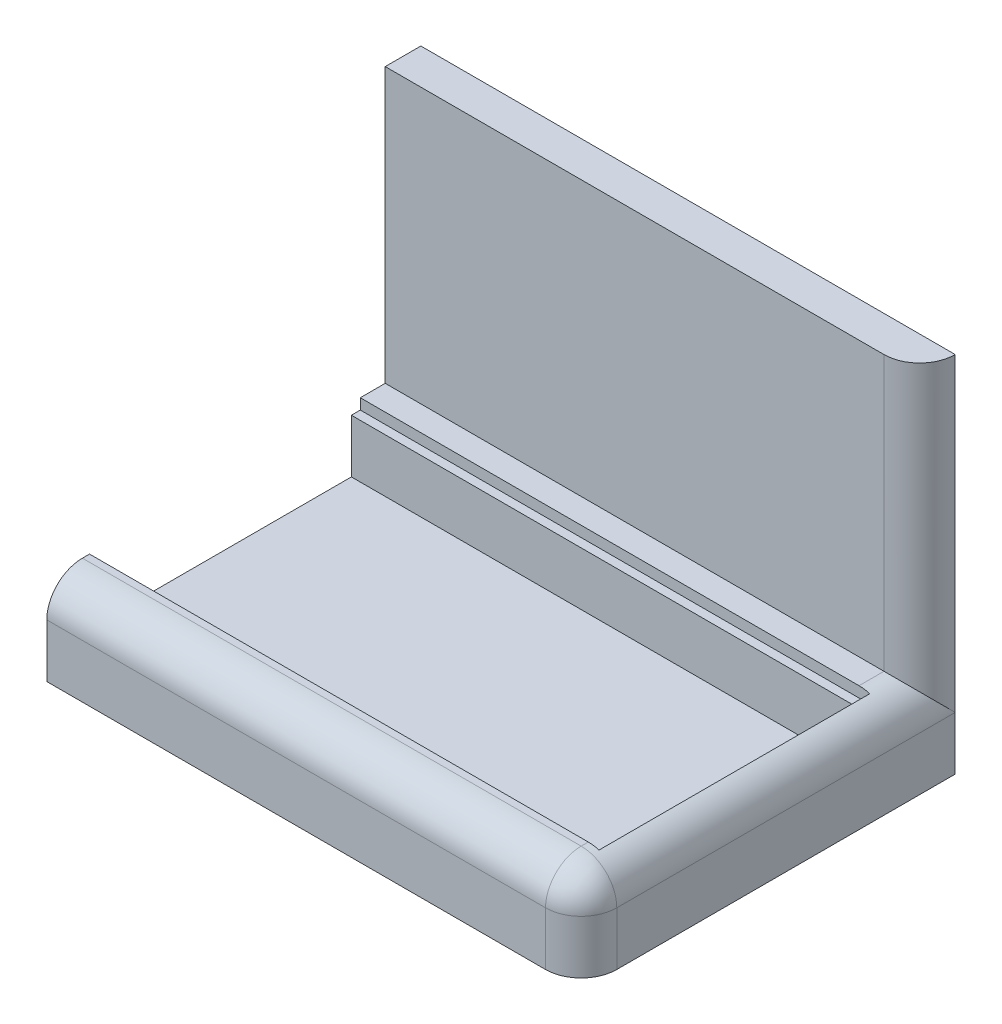
ISO-10303-21;
HEADER;
FILE_DESCRIPTION(('STEP AP214'),'2;1');
FILE_NAME('part.step','',(''),(''),'','','');
FILE_SCHEMA(('AUTOMOTIVE_DESIGN { 1 0 10303 214 1 1 1 1 }'));
ENDSEC;
DATA;
#1=APPLICATION_CONTEXT('core data for automotive mechanical design processes');
#2=APPLICATION_PROTOCOL_DEFINITION('international standard','automotive_design',2000,#1);
#3=PRODUCT_CONTEXT('',#1,'mechanical');
#4=PRODUCT('Part','Part','',(#3));
#5=PRODUCT_RELATED_PRODUCT_CATEGORY('part','',(#4));
#6=PRODUCT_DEFINITION_FORMATION('','',#4);
#7=PRODUCT_DEFINITION_CONTEXT('part definition',#1,'design');
#8=PRODUCT_DEFINITION('design','',#6,#7);
#9=PRODUCT_DEFINITION_SHAPE('','',#8);
#10=(LENGTH_UNIT() NAMED_UNIT(*) SI_UNIT(.MILLI.,.METRE.));
#11=(NAMED_UNIT(*) PLANE_ANGLE_UNIT() SI_UNIT($,.RADIAN.));
#12=(NAMED_UNIT(*) SI_UNIT($,.STERADIAN.) SOLID_ANGLE_UNIT());
#13=UNCERTAINTY_MEASURE_WITH_UNIT(LENGTH_MEASURE(1.E-05),#10,'distance_accuracy_value','');
#14=(GEOMETRIC_REPRESENTATION_CONTEXT(3) GLOBAL_UNCERTAINTY_ASSIGNED_CONTEXT((#13)) GLOBAL_UNIT_ASSIGNED_CONTEXT((#10,
#11,#12)) REPRESENTATION_CONTEXT('',''));
#15=CARTESIAN_POINT('',(0.,0.,0.));
#16=DIRECTION('',(0.,0.,1.));
#17=DIRECTION('',(1.,0.,0.));
#18=AXIS2_PLACEMENT_3D('',#15,#16,#17);
#19=CARTESIAN_POINT('',(0.,0.,-37.2835672247753));
#20=DIRECTION('',(0.,0.,1.));
#21=DIRECTION('',(1.,0.,0.));
#22=AXIS2_PLACEMENT_3D('',#19,#20,#21);
#23=PLANE('',#22);
#24=DIRECTION('',(0.,-1.,0.));
#25=VECTOR('',#24,1.);
#26=CARTESIAN_POINT('',(103.375697670527,0.,-37.2835672247753));
#27=LINE('',#26,#25);
#28=CARTESIAN_POINT('',(103.375697670527,102.,-37.2835672247753));
#29=VERTEX_POINT('',#28);
#30=CARTESIAN_POINT('',(103.375697670527,0.,-37.2835672247753));
#31=VERTEX_POINT('',#30);
#32=EDGE_CURVE('E179',#29,#31,#27,.T.);
#33=ORIENTED_EDGE('',*,*,#32,.F.);
#34=DIRECTION('',(-1.,0.,0.));
#35=VECTOR('',#34,1.);
#36=CARTESIAN_POINT('',(0.,102.,-37.2835672247753));
#37=LINE('',#36,#35);
#38=CARTESIAN_POINT('',(253.375697670527,102.,-37.2835672247753));
#39=VERTEX_POINT('',#38);
#40=EDGE_CURVE('E185',#39,#29,#37,.T.);
#41=ORIENTED_EDGE('',*,*,#40,.F.);
#42=DIRECTION('',(0.,-1.,0.));
#43=VECTOR('',#42,1.);
#44=CARTESIAN_POINT('',(253.375697670527,0.,-37.2835672247753));
#45=LINE('',#44,#43);
#46=CARTESIAN_POINT('',(253.375697670527,15.,-37.2835672247753));
#47=VERTEX_POINT('',#46);
#48=EDGE_CURVE('E80',#39,#47,#45,.T.);
#49=ORIENTED_EDGE('',*,*,#48,.T.);
#50=CARTESIAN_POINT('',(253.375697670527,0.,-37.2835672247753));
#51=VERTEX_POINT('',#50);
#52=EDGE_CURVE('E204',#47,#51,#45,.T.);
#53=ORIENTED_EDGE('',*,*,#52,.T.);
#54=DIRECTION('',(-1.,0.,0.));
#55=VECTOR('',#54,1.);
#56=CARTESIAN_POINT('',(253.375697670527,0.,-37.2835672247753));
#57=LINE('',#56,#55);
#58=EDGE_CURVE('E187',#51,#31,#57,.T.);
#59=ORIENTED_EDGE('',*,*,#58,.T.);
#60=EDGE_LOOP('',(#33,#41,#49,#53,#59));
#61=FACE_BOUND('',#60,.T.);
#62=ADVANCED_FACE('F56',(#61),#23,.F.);
#63=CARTESIAN_POINT('',(0.,25.,0.));
#64=DIRECTION('',(0.,1.,0.));
#65=DIRECTION('',(0.,0.,1.));
#66=AXIS2_PLACEMENT_3D('',#63,#64,#65);
#67=PLANE('',#66);
#68=DIRECTION('',(-1.,0.,0.));
#69=VECTOR('',#68,1.);
#70=CARTESIAN_POINT('',(-46.6243023294728,25.,-27.2835672247753));
#71=LINE('',#70,#69);
#72=CARTESIAN_POINT('',(243.375697670527,25.,-27.2835672247753));
#73=VERTEX_POINT('',#72);
#74=CARTESIAN_POINT('',(103.375697670527,25.,-27.2835672247753));
#75=VERTEX_POINT('',#74);
#76=EDGE_CURVE('E246',#73,#75,#71,.T.);
#77=ORIENTED_EDGE('',*,*,#76,.T.);
#78=DIRECTION('',(0.,0.,1.));
#79=VECTOR('',#78,1.);
#80=CARTESIAN_POINT('',(103.375697670527,25.,0.));
#81=LINE('',#80,#79);
#82=CARTESIAN_POINT('',(103.375697670527,25.,-20.2835672247753));
#83=VERTEX_POINT('',#82);
#84=EDGE_CURVE('E189',#75,#83,#81,.T.);
#85=ORIENTED_EDGE('',*,*,#84,.T.);
#86=DIRECTION('',(-1.,0.,0.));
#87=VECTOR('',#86,1.);
#88=CARTESIAN_POINT('',(79.630106090259,25.,-20.2835672247753));
#89=LINE('',#88,#87);
#90=CARTESIAN_POINT('',(243.375697670527,25.,-20.2835672247753));
#91=VERTEX_POINT('',#90);
#92=EDGE_CURVE('E230',#91,#83,#89,.T.);
#93=ORIENTED_EDGE('',*,*,#92,.F.);
#94=DIRECTION('',(0.,0.,-1.));
#95=VECTOR('',#94,1.);
#96=CARTESIAN_POINT('',(243.375697670527,25.,-27.2835672247753));
#97=LINE('',#96,#95);
#98=EDGE_CURVE('E270',#91,#73,#97,.T.);
#99=ORIENTED_EDGE('',*,*,#98,.T.);
#100=EDGE_LOOP('',(#77,#85,#93,#99));
#101=FACE_BOUND('',#100,.T.);
#102=ADVANCED_FACE('F352',(#101),#67,.T.);
#103=DIRECTION('',(1.,0.,0.));
#104=VECTOR('',#103,1.);
#105=CARTESIAN_POINT('',(79.630106090259,25.,55.7164327752247));
#106=LINE('',#105,#104);
#107=CARTESIAN_POINT('',(103.375697670527,25.,55.7164327752247));
#108=VERTEX_POINT('',#107);
#109=CARTESIAN_POINT('',(243.375697670527,25.,55.7164327752247));
#110=VERTEX_POINT('',#109);
#111=EDGE_CURVE('E224',#108,#110,#106,.T.);
#112=ORIENTED_EDGE('',*,*,#111,.F.);
#113=CARTESIAN_POINT('',(103.375697670527,25.,57.7164327752247));
#114=VERTEX_POINT('',#113);
#115=EDGE_CURVE('E319',#108,#114,#81,.T.);
#116=ORIENTED_EDGE('',*,*,#115,.T.);
#117=DIRECTION('',(1.,0.,0.));
#118=VECTOR('',#117,1.);
#119=CARTESIAN_POINT('',(253.375697670527,25.,57.7164327752247));
#120=LINE('',#119,#118);
#121=CARTESIAN_POINT('',(243.375697670527,25.,57.7164327752247));
#122=VERTEX_POINT('',#121);
#123=EDGE_CURVE('E60',#114,#122,#120,.T.);
#124=ORIENTED_EDGE('',*,*,#123,.T.);
#125=DIRECTION('',(0.,0.,-1.));
#126=VECTOR('',#125,1.);
#127=CARTESIAN_POINT('',(243.375697670527,25.,-27.2835672247753));
#128=LINE('',#127,#126);
#129=EDGE_CURVE('E273',#122,#110,#128,.T.);
#130=ORIENTED_EDGE('',*,*,#129,.T.);
#131=EDGE_LOOP('',(#112,#116,#124,#130));
#132=FACE_BOUND('',#131,.T.);
#133=ADVANCED_FACE('F358',(#132),#67,.T.);
#134=CARTESIAN_POINT('',(0.,0.,-27.2835672247753));
#135=DIRECTION('',(0.,0.,1.));
#136=DIRECTION('',(1.,0.,0.));
#137=AXIS2_PLACEMENT_3D('',#134,#135,#136);
#138=PLANE('',#137);
#139=DIRECTION('',(-1.,0.,0.));
#140=VECTOR('',#139,1.);
#141=CARTESIAN_POINT('',(-36.6243023294728,102.,-27.2835672247753));
#142=LINE('',#141,#140);
#143=CARTESIAN_POINT('',(243.375697670527,102.,-27.2835672247753));
#144=VERTEX_POINT('',#143);
#145=CARTESIAN_POINT('',(103.375697670527,102.,-27.2835672247753));
#146=VERTEX_POINT('',#145);
#147=EDGE_CURVE('E66',#144,#146,#142,.T.);
#148=ORIENTED_EDGE('',*,*,#147,.T.);
#149=DIRECTION('',(0.,-1.,0.));
#150=VECTOR('',#149,1.);
#151=CARTESIAN_POINT('',(103.375697670527,0.,-27.2835672247753));
#152=LINE('',#151,#150);
#153=EDGE_CURVE('E73',#146,#75,#152,.T.);
#154=ORIENTED_EDGE('',*,*,#153,.T.);
#155=ORIENTED_EDGE('',*,*,#76,.F.);
#156=DIRECTION('',(0.,-1.,0.));
#157=VECTOR('',#156,1.);
#158=CARTESIAN_POINT('',(243.375697670527,112.,-27.2835672247753));
#159=LINE('',#158,#157);
#160=EDGE_CURVE('E281',#73,#144,#159,.F.);
#161=ORIENTED_EDGE('',*,*,#160,.T.);
#162=EDGE_LOOP('',(#148,#154,#155,#161));
#163=FACE_BOUND('',#162,.T.);
#164=ADVANCED_FACE('F290',(#163),#138,.T.);
#165=CARTESIAN_POINT('',(-46.6243023294728,25.,67.7164327752247));
#166=DIRECTION('',(0.,0.,-1.));
#167=DIRECTION('',(-1.,0.,0.));
#168=AXIS2_PLACEMENT_3D('',#165,#166,#167);
#169=PLANE('',#168);
#170=DIRECTION('',(0.,1.,0.));
#171=VECTOR('',#170,1.);
#172=CARTESIAN_POINT('',(103.375697670527,25.,67.7164327752247));
#173=LINE('',#172,#171);
#174=CARTESIAN_POINT('',(103.375697670527,0.,67.7164327752247));
#175=VERTEX_POINT('',#174);
#176=CARTESIAN_POINT('',(103.375697670527,15.,67.7164327752247));
#177=VERTEX_POINT('',#176);
#178=EDGE_CURVE('E308',#175,#177,#173,.T.);
#179=ORIENTED_EDGE('',*,*,#178,.F.);
#180=DIRECTION('',(1.,0.,0.));
#181=VECTOR('',#180,1.);
#182=CARTESIAN_POINT('',(-46.6243023294728,0.,67.7164327752247));
#183=LINE('',#182,#181);
#184=CARTESIAN_POINT('',(243.375697670527,0.,67.7164327752247));
#185=VERTEX_POINT('',#184);
#186=EDGE_CURVE('E243',#175,#185,#183,.T.);
#187=ORIENTED_EDGE('',*,*,#186,.T.);
#188=DIRECTION('',(0.,-1.,0.));
#189=VECTOR('',#188,1.);
#190=CARTESIAN_POINT('',(243.375697670527,25.,67.7164327752247));
#191=LINE('',#190,#189);
#192=CARTESIAN_POINT('',(243.375697670527,15.,67.7164327752247));
#193=VERTEX_POINT('',#192);
#194=EDGE_CURVE('E265',#185,#193,#191,.F.);
#195=ORIENTED_EDGE('',*,*,#194,.T.);
#196=DIRECTION('',(1.,0.,0.));
#197=VECTOR('',#196,1.);
#198=CARTESIAN_POINT('',(-46.6243023294728,15.,67.7164327752247));
#199=LINE('',#198,#197);
#200=EDGE_CURVE('E254',#193,#177,#199,.F.);
#201=ORIENTED_EDGE('',*,*,#200,.T.);
#202=EDGE_LOOP('',(#179,#187,#195,#201));
#203=FACE_BOUND('',#202,.T.);
#204=ADVANCED_FACE('F372',(#203),#169,.F.);
#205=CARTESIAN_POINT('',(0.,0.,0.));
#206=DIRECTION('',(0.,1.,0.));
#207=DIRECTION('',(0.,0.,1.));
#208=AXIS2_PLACEMENT_3D('',#205,#206,#207);
#209=PLANE('',#208);
#210=DIRECTION('',(0.,0.,1.));
#211=VECTOR('',#210,1.);
#212=CARTESIAN_POINT('',(103.375697670527,0.,0.));
#213=LINE('',#212,#211);
#214=EDGE_CURVE('E306',#31,#175,#213,.T.);
#215=ORIENTED_EDGE('',*,*,#214,.F.);
#216=ORIENTED_EDGE('',*,*,#58,.F.);
#217=DIRECTION('',(0.,0.,-1.));
#218=VECTOR('',#217,1.);
#219=CARTESIAN_POINT('',(253.375697670527,0.,-27.2835672247753));
#220=LINE('',#219,#218);
#221=CARTESIAN_POINT('',(253.375697670527,0.,57.7164327752247));
#222=VERTEX_POINT('',#221);
#223=EDGE_CURVE('E249',#222,#51,#220,.T.);
#224=ORIENTED_EDGE('',*,*,#223,.F.);
#225=CARTESIAN_POINT('',(243.375697670527,0.,57.7164327752247));
#226=DIRECTION('',(0.,1.,0.));
#227=DIRECTION('',(0.,0.,1.));
#228=AXIS2_PLACEMENT_3D('',#225,#226,#227);
#229=CIRCLE('',#228,10.);
#230=EDGE_CURVE('E262',#222,#185,#229,.F.);
#231=ORIENTED_EDGE('',*,*,#230,.T.);
#232=ORIENTED_EDGE('',*,*,#186,.F.);
#233=EDGE_LOOP('',(#215,#216,#224,#231,#232));
#234=FACE_BOUND('',#233,.T.);
#235=ADVANCED_FACE('F304',(#234),#209,.F.);
#236=CARTESIAN_POINT('',(79.630106090259,22.,-20.2835672247753));
#237=DIRECTION('',(0.,0.,-1.));
#238=DIRECTION('',(-1.,0.,0.));
#239=AXIS2_PLACEMENT_3D('',#236,#237,#238);
#240=PLANE('',#239);
#241=DIRECTION('',(0.,1.,0.));
#242=VECTOR('',#241,1.);
#243=CARTESIAN_POINT('',(103.375697670527,22.,-20.2835672247753));
#244=LINE('',#243,#242);
#245=CARTESIAN_POINT('',(103.375697670527,22.,-20.2835672247753));
#246=VERTEX_POINT('',#245);
#247=EDGE_CURVE('E188',#246,#83,#244,.T.);
#248=ORIENTED_EDGE('',*,*,#247,.F.);
#249=DIRECTION('',(-1.,0.,0.));
#250=VECTOR('',#249,1.);
#251=CARTESIAN_POINT('',(79.630106090259,22.,-20.2835672247753));
#252=LINE('',#251,#250);
#253=CARTESIAN_POINT('',(246.375697670527,22.,-20.2835672247753));
#254=VERTEX_POINT('',#253);
#255=EDGE_CURVE('E233',#254,#246,#252,.T.);
#256=ORIENTED_EDGE('',*,*,#255,.F.);
#257=DIRECTION('',(0.,1.,0.));
#258=VECTOR('',#257,1.);
#259=CARTESIAN_POINT('',(246.375697670527,22.,-20.2835672247753));
#260=LINE('',#259,#258);
#261=CARTESIAN_POINT('',(246.375697670527,24.5393920141695,-20.2835672247753));
#262=VERTEX_POINT('',#261);
#263=EDGE_CURVE('E240',#254,#262,#260,.T.);
#264=ORIENTED_EDGE('',*,*,#263,.T.);
#265=CARTESIAN_POINT('',(243.375697670527,15.,-20.2835672247753));
#266=DIRECTION('',(0.,0.,-1.));
#267=DIRECTION('',(-1.,0.,0.));
#268=AXIS2_PLACEMENT_3D('',#265,#266,#267);
#269=CIRCLE('',#268,10.);
#270=EDGE_CURVE('E280',#262,#91,#269,.F.);
#271=ORIENTED_EDGE('',*,*,#270,.T.);
#272=ORIENTED_EDGE('',*,*,#92,.T.);
#273=EDGE_LOOP('',(#248,#256,#264,#271,#272));
#274=FACE_BOUND('',#273,.T.);
#275=ADVANCED_FACE('F347',(#274),#240,.F.);
#276=CARTESIAN_POINT('',(79.630106090259,22.,55.7164327752247));
#277=DIRECTION('',(0.,0.,1.));
#278=DIRECTION('',(1.,0.,0.));
#279=AXIS2_PLACEMENT_3D('',#276,#277,#278);
#280=PLANE('',#279);
#281=DIRECTION('',(0.,-1.,0.));
#282=VECTOR('',#281,1.);
#283=CARTESIAN_POINT('',(103.375697670527,22.,55.7164327752247));
#284=LINE('',#283,#282);
#285=CARTESIAN_POINT('',(103.375697670527,22.,55.7164327752247));
#286=VERTEX_POINT('',#285);
#287=EDGE_CURVE('E323',#108,#286,#284,.T.);
#288=ORIENTED_EDGE('',*,*,#287,.F.);
#289=ORIENTED_EDGE('',*,*,#111,.T.);
#290=CARTESIAN_POINT('',(243.375697670527,15.,55.7164327752247));
#291=DIRECTION('',(0.,0.,1.));
#292=DIRECTION('',(1.,0.,0.));
#293=AXIS2_PLACEMENT_3D('',#290,#291,#292);
#294=CIRCLE('',#293,10.);
#295=CARTESIAN_POINT('',(246.375697670527,24.5393920141695,55.7164327752247));
#296=VERTEX_POINT('',#295);
#297=EDGE_CURVE('E276',#110,#296,#294,.F.);
#298=ORIENTED_EDGE('',*,*,#297,.T.);
#299=DIRECTION('',(0.,1.,0.));
#300=VECTOR('',#299,1.);
#301=CARTESIAN_POINT('',(246.375697670527,22.,55.7164327752247));
#302=LINE('',#301,#300);
#303=CARTESIAN_POINT('',(246.375697670527,22.,55.7164327752247));
#304=VERTEX_POINT('',#303);
#305=EDGE_CURVE('E236',#304,#296,#302,.T.);
#306=ORIENTED_EDGE('',*,*,#305,.F.);
#307=DIRECTION('',(1.,0.,0.));
#308=VECTOR('',#307,1.);
#309=CARTESIAN_POINT('',(79.630106090259,22.,55.7164327752247));
#310=LINE('',#309,#308);
#311=EDGE_CURVE('E227',#286,#304,#310,.T.);
#312=ORIENTED_EDGE('',*,*,#311,.F.);
#313=EDGE_LOOP('',(#288,#289,#298,#306,#312));
#314=FACE_BOUND('',#313,.T.);
#315=ADVANCED_FACE('F337',(#314),#280,.F.);
#316=CARTESIAN_POINT('',(0.,22.,0.));
#317=DIRECTION('',(0.,1.,0.));
#318=DIRECTION('',(0.,0.,1.));
#319=AXIS2_PLACEMENT_3D('',#316,#317,#318);
#320=PLANE('',#319);
#321=ORIENTED_EDGE('',*,*,#255,.T.);
#322=DIRECTION('',(0.,0.,1.));
#323=VECTOR('',#322,1.);
#324=CARTESIAN_POINT('',(103.375697670527,22.,0.));
#325=LINE('',#324,#323);
#326=CARTESIAN_POINT('',(103.375697670527,22.,-17.7835672247753));
#327=VERTEX_POINT('',#326);
#328=EDGE_CURVE('E316',#246,#327,#325,.T.);
#329=ORIENTED_EDGE('',*,*,#328,.T.);
#330=DIRECTION('',(1.,0.,0.));
#331=VECTOR('',#330,1.);
#332=CARTESIAN_POINT('',(82.130106090259,22.,-17.7835672247753));
#333=LINE('',#332,#331);
#334=CARTESIAN_POINT('',(243.875697670527,22.,-17.7835672247753));
#335=VERTEX_POINT('',#334);
#336=EDGE_CURVE('E210',#327,#335,#333,.T.);
#337=ORIENTED_EDGE('',*,*,#336,.T.);
#338=DIRECTION('',(0.,0.,1.));
#339=VECTOR('',#338,1.);
#340=CARTESIAN_POINT('',(243.875697670527,22.,-17.7835672247753));
#341=LINE('',#340,#339);
#342=CARTESIAN_POINT('',(243.875697670527,22.,53.2164327752247));
#343=VERTEX_POINT('',#342);
#344=EDGE_CURVE('E217',#335,#343,#341,.T.);
#345=ORIENTED_EDGE('',*,*,#344,.T.);
#346=DIRECTION('',(1.,0.,0.));
#347=VECTOR('',#346,1.);
#348=CARTESIAN_POINT('',(82.130106090259,22.,53.2164327752247));
#349=LINE('',#348,#347);
#350=CARTESIAN_POINT('',(103.375697670527,22.,53.2164327752247));
#351=VERTEX_POINT('',#350);
#352=EDGE_CURVE('E206',#351,#343,#349,.T.);
#353=ORIENTED_EDGE('',*,*,#352,.F.);
#354=EDGE_CURVE('E199',#351,#286,#325,.T.);
#355=ORIENTED_EDGE('',*,*,#354,.T.);
#356=ORIENTED_EDGE('',*,*,#311,.T.);
#357=DIRECTION('',(0.,0.,-1.));
#358=VECTOR('',#357,1.);
#359=CARTESIAN_POINT('',(246.375697670527,22.,-20.2835672247753));
#360=LINE('',#359,#358);
#361=EDGE_CURVE('E229',#304,#254,#360,.T.);
#362=ORIENTED_EDGE('',*,*,#361,.T.);
#363=EDGE_LOOP('',(#321,#329,#337,#345,#353,#355,#356,#362));
#364=FACE_BOUND('',#363,.T.);
#365=ADVANCED_FACE('F333',(#364),#320,.T.);
#366=CARTESIAN_POINT('',(82.130106090259,7.,-17.7835672247753));
#367=DIRECTION('',(0.,0.,1.));
#368=DIRECTION('',(1.,0.,0.));
#369=AXIS2_PLACEMENT_3D('',#366,#367,#368);
#370=PLANE('',#369);
#371=ORIENTED_EDGE('',*,*,#336,.F.);
#372=DIRECTION('',(0.,-1.,0.));
#373=VECTOR('',#372,1.);
#374=CARTESIAN_POINT('',(103.375697670527,7.,-17.7835672247753));
#375=LINE('',#374,#373);
#376=CARTESIAN_POINT('',(103.375697670527,7.,-17.7835672247753));
#377=VERTEX_POINT('',#376);
#378=EDGE_CURVE('E320',#327,#377,#375,.T.);
#379=ORIENTED_EDGE('',*,*,#378,.T.);
#380=DIRECTION('',(1.,0.,0.));
#381=VECTOR('',#380,1.);
#382=CARTESIAN_POINT('',(82.130106090259,7.,-17.7835672247753));
#383=LINE('',#382,#381);
#384=CARTESIAN_POINT('',(243.875697670527,7.,-17.7835672247753));
#385=VERTEX_POINT('',#384);
#386=EDGE_CURVE('E213',#377,#385,#383,.T.);
#387=ORIENTED_EDGE('',*,*,#386,.T.);
#388=DIRECTION('',(0.,1.,0.));
#389=VECTOR('',#388,1.);
#390=CARTESIAN_POINT('',(243.875697670527,7.,-17.7835672247753));
#391=LINE('',#390,#389);
#392=EDGE_CURVE('E221',#385,#335,#391,.T.);
#393=ORIENTED_EDGE('',*,*,#392,.T.);
#394=EDGE_LOOP('',(#371,#379,#387,#393));
#395=FACE_BOUND('',#394,.T.);
#396=ADVANCED_FACE('F397',(#395),#370,.T.);
#397=CARTESIAN_POINT('',(82.130106090259,7.,53.2164327752247));
#398=DIRECTION('',(0.,0.,1.));
#399=DIRECTION('',(1.,0.,0.));
#400=AXIS2_PLACEMENT_3D('',#397,#398,#399);
#401=PLANE('',#400);
#402=DIRECTION('',(0.,-1.,0.));
#403=VECTOR('',#402,1.);
#404=CARTESIAN_POINT('',(103.375697670527,7.,53.2164327752247));
#405=LINE('',#404,#403);
#406=CARTESIAN_POINT('',(103.375697670527,7.,53.2164327752247));
#407=VERTEX_POINT('',#406);
#408=EDGE_CURVE('E327',#351,#407,#405,.T.);
#409=ORIENTED_EDGE('',*,*,#408,.F.);
#410=ORIENTED_EDGE('',*,*,#352,.T.);
#411=DIRECTION('',(0.,1.,0.));
#412=VECTOR('',#411,1.);
#413=CARTESIAN_POINT('',(243.875697670527,7.,53.2164327752247));
#414=LINE('',#413,#412);
#415=CARTESIAN_POINT('',(243.875697670527,7.,53.2164327752247));
#416=VERTEX_POINT('',#415);
#417=EDGE_CURVE('E215',#416,#343,#414,.T.);
#418=ORIENTED_EDGE('',*,*,#417,.F.);
#419=DIRECTION('',(1.,0.,0.));
#420=VECTOR('',#419,1.);
#421=CARTESIAN_POINT('',(82.130106090259,7.,53.2164327752247));
#422=LINE('',#421,#420);
#423=EDGE_CURVE('E207',#407,#416,#422,.T.);
#424=ORIENTED_EDGE('',*,*,#423,.F.);
#425=EDGE_LOOP('',(#409,#410,#418,#424));
#426=FACE_BOUND('',#425,.T.);
#427=ADVANCED_FACE('F395',(#426),#401,.F.);
#428=CARTESIAN_POINT('',(0.,7.,0.));
#429=DIRECTION('',(0.,1.,0.));
#430=DIRECTION('',(0.,0.,1.));
#431=AXIS2_PLACEMENT_3D('',#428,#429,#430);
#432=PLANE('',#431);
#433=ORIENTED_EDGE('',*,*,#386,.F.);
#434=DIRECTION('',(0.,0.,1.));
#435=VECTOR('',#434,1.);
#436=CARTESIAN_POINT('',(103.375697670527,7.,0.));
#437=LINE('',#436,#435);
#438=EDGE_CURVE('E325',#377,#407,#437,.T.);
#439=ORIENTED_EDGE('',*,*,#438,.T.);
#440=ORIENTED_EDGE('',*,*,#423,.T.);
#441=DIRECTION('',(0.,0.,1.));
#442=VECTOR('',#441,1.);
#443=CARTESIAN_POINT('',(243.875697670527,7.,-17.7835672247753));
#444=LINE('',#443,#442);
#445=EDGE_CURVE('E209',#385,#416,#444,.T.);
#446=ORIENTED_EDGE('',*,*,#445,.F.);
#447=EDGE_LOOP('',(#433,#439,#440,#446));
#448=FACE_BOUND('',#447,.T.);
#449=ADVANCED_FACE('F392',(#448),#432,.T.);
#450=CARTESIAN_POINT('',(0.,15.,57.7164327752247));
#451=DIRECTION('',(-1.,0.,0.));
#452=DIRECTION('',(0.,0.,1.));
#453=AXIS2_PLACEMENT_3D('',#450,#451,#452);
#454=CYLINDRICAL_SURFACE('',#453,10.);
#455=ORIENTED_EDGE('',*,*,#123,.F.);
#456=CARTESIAN_POINT('',(103.375697670527,15.,57.7164327752247));
#457=DIRECTION('',(-1.,0.,0.));
#458=DIRECTION('',(0.,0.,1.));
#459=AXIS2_PLACEMENT_3D('',#456,#457,#458);
#460=CIRCLE('',#459,10.);
#461=EDGE_CURVE('E310',#114,#177,#460,.F.);
#462=ORIENTED_EDGE('',*,*,#461,.T.);
#463=ORIENTED_EDGE('',*,*,#200,.F.);
#464=CARTESIAN_POINT('',(243.375697670527,15.,57.7164327752247));
#465=DIRECTION('',(-1.,0.,0.));
#466=DIRECTION('',(0.,0.,1.));
#467=AXIS2_PLACEMENT_3D('',#464,#465,#466);
#468=CIRCLE('',#467,10.);
#469=EDGE_CURVE('E267',#193,#122,#468,.T.);
#470=ORIENTED_EDGE('',*,*,#469,.T.);
#471=EDGE_LOOP('',(#455,#462,#463,#470));
#472=FACE_BOUND('',#471,.T.);
#473=ADVANCED_FACE('F360',(#472),#454,.T.);
#474=CARTESIAN_POINT('',(-46.6243023294728,102.,0.));
#475=DIRECTION('',(0.,1.,0.));
#476=DIRECTION('',(0.,0.,1.));
#477=AXIS2_PLACEMENT_3D('',#474,#475,#476);
#478=PLANE('',#477);
#479=ORIENTED_EDGE('',*,*,#40,.T.);
#480=DIRECTION('',(0.,0.,1.));
#481=VECTOR('',#480,1.);
#482=CARTESIAN_POINT('',(103.375697670527,102.,0.));
#483=LINE('',#482,#481);
#484=EDGE_CURVE('E14',#29,#146,#483,.T.);
#485=ORIENTED_EDGE('',*,*,#484,.T.);
#486=ORIENTED_EDGE('',*,*,#147,.F.);
#487=CARTESIAN_POINT('',(243.375697670527,102.,-37.2835672247753));
#488=DIRECTION('',(0.,1.,0.));
#489=DIRECTION('',(0.,0.,1.));
#490=AXIS2_PLACEMENT_3D('',#487,#488,#489);
#491=CIRCLE('',#490,10.);
#492=EDGE_CURVE('E193',#39,#144,#491,.F.);
#493=ORIENTED_EDGE('',*,*,#492,.F.);
#494=EDGE_LOOP('',(#479,#485,#486,#493));
#495=FACE_BOUND('',#494,.T.);
#496=ADVANCED_FACE('F191',(#495),#478,.T.);
#497=CARTESIAN_POINT('',(243.375697670527,25.,-37.2835672247753));
#498=DIRECTION('',(0.,1.,0.));
#499=DIRECTION('',(0.,0.,1.));
#500=AXIS2_PLACEMENT_3D('',#497,#498,#499);
#501=CYLINDRICAL_SURFACE('',#500,10.);
#502=ORIENTED_EDGE('',*,*,#48,.F.);
#503=ORIENTED_EDGE('',*,*,#492,.T.);
#504=ORIENTED_EDGE('',*,*,#160,.F.);
#505=CARTESIAN_POINT('',(243.375697670527,15.,-37.2835672247753));
#506=DIRECTION('',(0.,0.707106781186547,-0.707106781186547));
#507=DIRECTION('',(0.,0.707106781186547,0.707106781186547));
#508=AXIS2_PLACEMENT_3D('',#505,#506,#507);
#509=ELLIPSE('',#508,14.1421356237309,10.);
#510=EDGE_CURVE('E287',#47,#73,#509,.F.);
#511=ORIENTED_EDGE('',*,*,#510,.F.);
#512=EDGE_LOOP('',(#502,#503,#504,#511));
#513=FACE_BOUND('',#512,.T.);
#514=ADVANCED_FACE('F58',(#513),#501,.T.);
#515=CARTESIAN_POINT('',(253.375697670527,25.,-27.2835672247753));
#516=DIRECTION('',(-1.,0.,0.));
#517=DIRECTION('',(0.,0.,1.));
#518=AXIS2_PLACEMENT_3D('',#515,#516,#517);
#519=PLANE('',#518);
#520=ORIENTED_EDGE('',*,*,#52,.F.);
#521=DIRECTION('',(0.,0.,-1.));
#522=VECTOR('',#521,1.);
#523=CARTESIAN_POINT('',(253.375697670527,15.,57.7164327752247));
#524=LINE('',#523,#522);
#525=CARTESIAN_POINT('',(253.375697670527,15.,57.7164327752247));
#526=VERTEX_POINT('',#525);
#527=EDGE_CURVE('E257',#47,#526,#524,.F.);
#528=ORIENTED_EDGE('',*,*,#527,.T.);
#529=DIRECTION('',(0.,-1.,0.));
#530=VECTOR('',#529,1.);
#531=CARTESIAN_POINT('',(253.375697670527,25.,57.7164327752247));
#532=LINE('',#531,#530);
#533=EDGE_CURVE('E259',#526,#222,#532,.T.);
#534=ORIENTED_EDGE('',*,*,#533,.T.);
#535=ORIENTED_EDGE('',*,*,#223,.T.);
#536=EDGE_LOOP('',(#520,#528,#534,#535));
#537=FACE_BOUND('',#536,.T.);
#538=ADVANCED_FACE('F299',(#537),#519,.F.);
#539=CARTESIAN_POINT('',(246.375697670527,22.,-20.2835672247753));
#540=DIRECTION('',(1.,0.,0.));
#541=DIRECTION('',(0.,0.,-1.));
#542=AXIS2_PLACEMENT_3D('',#539,#540,#541);
#543=PLANE('',#542);
#544=ORIENTED_EDGE('',*,*,#305,.T.);
#545=DIRECTION('',(0.,0.,1.));
#546=VECTOR('',#545,1.);
#547=CARTESIAN_POINT('',(246.375697670527,24.5393920141695,55.7164327752247));
#548=LINE('',#547,#546);
#549=EDGE_CURVE('E278',#296,#262,#548,.F.);
#550=ORIENTED_EDGE('',*,*,#549,.T.);
#551=ORIENTED_EDGE('',*,*,#263,.F.);
#552=ORIENTED_EDGE('',*,*,#361,.F.);
#553=EDGE_LOOP('',(#544,#550,#551,#552));
#554=FACE_BOUND('',#553,.T.);
#555=ADVANCED_FACE('F343',(#554),#543,.F.);
#556=CARTESIAN_POINT('',(243.875697670527,7.,-17.7835672247753));
#557=DIRECTION('',(-1.,0.,0.));
#558=DIRECTION('',(0.,0.,1.));
#559=AXIS2_PLACEMENT_3D('',#556,#557,#558);
#560=PLANE('',#559);
#561=ORIENTED_EDGE('',*,*,#344,.F.);
#562=ORIENTED_EDGE('',*,*,#392,.F.);
#563=ORIENTED_EDGE('',*,*,#445,.T.);
#564=ORIENTED_EDGE('',*,*,#417,.T.);
#565=EDGE_LOOP('',(#561,#562,#563,#564));
#566=FACE_BOUND('',#565,.T.);
#567=ADVANCED_FACE('F401',(#566),#560,.T.);
#568=CARTESIAN_POINT('',(243.375697670527,15.,1.42211212204226E-13));
#569=DIRECTION('',(0.,0.,1.));
#570=DIRECTION('',(1.,0.,0.));
#571=AXIS2_PLACEMENT_3D('',#568,#569,#570);
#572=CYLINDRICAL_SURFACE('',#571,10.);
#573=ORIENTED_EDGE('',*,*,#297,.F.);
#574=ORIENTED_EDGE('',*,*,#129,.F.);
#575=CARTESIAN_POINT('',(243.375697670527,15.,57.7164327752247));
#576=DIRECTION('',(0.,0.,1.));
#577=DIRECTION('',(1.,0.,0.));
#578=AXIS2_PLACEMENT_3D('',#575,#576,#577);
#579=CIRCLE('',#578,10.);
#580=EDGE_CURVE('E197',#526,#122,#579,.T.);
#581=ORIENTED_EDGE('',*,*,#580,.F.);
#582=ORIENTED_EDGE('',*,*,#527,.F.);
#583=ORIENTED_EDGE('',*,*,#510,.T.);
#584=ORIENTED_EDGE('',*,*,#98,.F.);
#585=ORIENTED_EDGE('',*,*,#270,.F.);
#586=ORIENTED_EDGE('',*,*,#549,.F.);
#587=EDGE_LOOP('',(#573,#574,#581,#582,#583,#584,#585,#586));
#588=FACE_BOUND('',#587,.T.);
#589=ADVANCED_FACE('F366',(#588),#572,.T.);
#590=CARTESIAN_POINT('',(243.375697670527,15.,57.7164327752247));
#591=DIRECTION('',(-1.,0.,0.));
#592=DIRECTION('',(0.,0.,1.));
#593=AXIS2_PLACEMENT_3D('',#590,#591,#592);
#594=SPHERICAL_SURFACE('',#593,10.);
#595=ORIENTED_EDGE('',*,*,#580,.T.);
#596=ORIENTED_EDGE('',*,*,#469,.F.);
#597=CARTESIAN_POINT('',(243.375697670527,15.,57.7164327752247));
#598=DIRECTION('',(0.,-1.,0.));
#599=DIRECTION('',(0.,0.,-1.));
#600=AXIS2_PLACEMENT_3D('',#597,#598,#599);
#601=CIRCLE('',#600,10.);
#602=EDGE_CURVE('E194',#526,#193,#601,.T.);
#603=ORIENTED_EDGE('',*,*,#602,.F.);
#604=EDGE_LOOP('',(#595,#596,#603));
#605=FACE_BOUND('',#604,.T.);
#606=ADVANCED_FACE('F367',(#605),#594,.T.);
#607=CARTESIAN_POINT('',(243.375697670527,25.,57.7164327752247));
#608=DIRECTION('',(0.,-1.,0.));
#609=DIRECTION('',(0.,0.,-1.));
#610=AXIS2_PLACEMENT_3D('',#607,#608,#609);
#611=CYLINDRICAL_SURFACE('',#610,10.);
#612=ORIENTED_EDGE('',*,*,#602,.T.);
#613=ORIENTED_EDGE('',*,*,#194,.F.);
#614=ORIENTED_EDGE('',*,*,#230,.F.);
#615=ORIENTED_EDGE('',*,*,#533,.F.);
#616=EDGE_LOOP('',(#612,#613,#614,#615));
#617=FACE_BOUND('',#616,.T.);
#618=ADVANCED_FACE('F370',(#617),#611,.T.);
#619=CARTESIAN_POINT('',(103.375697670527,0.,0.));
#620=DIRECTION('',(-1.,0.,0.));
#621=DIRECTION('',(0.,0.,1.));
#622=AXIS2_PLACEMENT_3D('',#619,#620,#621);
#623=PLANE('',#622);
#624=ORIENTED_EDGE('',*,*,#408,.T.);
#625=ORIENTED_EDGE('',*,*,#438,.F.);
#626=ORIENTED_EDGE('',*,*,#378,.F.);
#627=ORIENTED_EDGE('',*,*,#328,.F.);
#628=ORIENTED_EDGE('',*,*,#247,.T.);
#629=ORIENTED_EDGE('',*,*,#84,.F.);
#630=ORIENTED_EDGE('',*,*,#153,.F.);
#631=ORIENTED_EDGE('',*,*,#484,.F.);
#632=ORIENTED_EDGE('',*,*,#32,.T.);
#633=ORIENTED_EDGE('',*,*,#214,.T.);
#634=ORIENTED_EDGE('',*,*,#178,.T.);
#635=ORIENTED_EDGE('',*,*,#461,.F.);
#636=ORIENTED_EDGE('',*,*,#115,.F.);
#637=ORIENTED_EDGE('',*,*,#287,.T.);
#638=ORIENTED_EDGE('',*,*,#354,.F.);
#639=EDGE_LOOP('',(#624,#625,#626,#627,#628,#629,#630,#631,#632,#633,#634,#635,#636,#637,#638));
#640=FACE_BOUND('',#639,.T.);
#641=ADVANCED_FACE('F178',(#640),#623,.T.);
#642=CLOSED_SHELL('',(#62,#102,#133,#164,#204,#235,#275,#315,#365,#396,#427,#449,#473,#496,#514,
#538,#555,#567,#589,#606,#618,#641));
#643=MANIFOLD_SOLID_BREP('B2',#642);
#644=ADVANCED_BREP_SHAPE_REPRESENTATION('',(#18,#643),#14);
#645=SHAPE_DEFINITION_REPRESENTATION(#9,#644);
ENDSEC;
END-ISO-10303-21;
